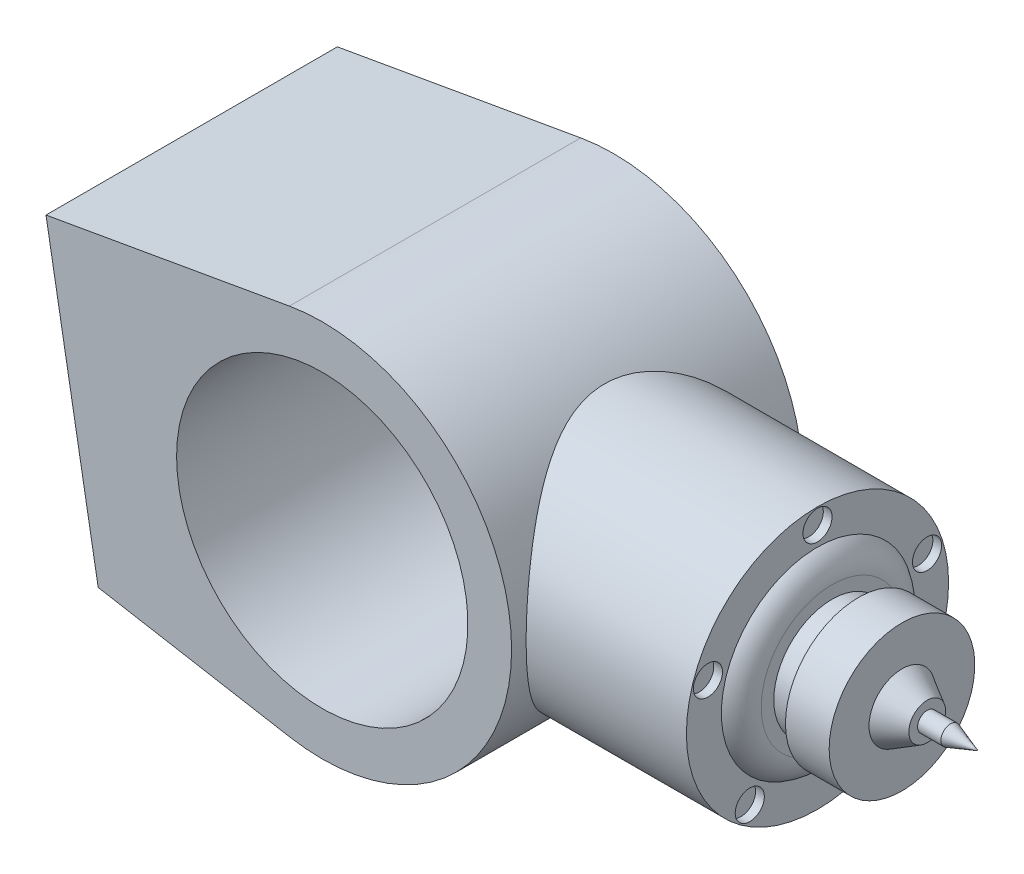
ISO-10303-21;
HEADER;
FILE_DESCRIPTION(('STEP AP214'),'2;1');
FILE_NAME('part.step','',(''),(''),'','','');
FILE_SCHEMA(('AUTOMOTIVE_DESIGN { 1 0 10303 214 1 1 1 1 }'));
ENDSEC;
DATA;
#1=APPLICATION_CONTEXT('core data for automotive mechanical design processes');
#2=APPLICATION_PROTOCOL_DEFINITION('international standard','automotive_design',2000,#1);
#3=PRODUCT_CONTEXT('',#1,'mechanical');
#4=PRODUCT('Part','Part','',(#3));
#5=PRODUCT_RELATED_PRODUCT_CATEGORY('part','',(#4));
#6=PRODUCT_DEFINITION_FORMATION('','',#4);
#7=PRODUCT_DEFINITION_CONTEXT('part definition',#1,'design');
#8=PRODUCT_DEFINITION('design','',#6,#7);
#9=PRODUCT_DEFINITION_SHAPE('','',#8);
#10=(LENGTH_UNIT() NAMED_UNIT(*) SI_UNIT(.MILLI.,.METRE.));
#11=(NAMED_UNIT(*) PLANE_ANGLE_UNIT() SI_UNIT($,.RADIAN.));
#12=(NAMED_UNIT(*) SI_UNIT($,.STERADIAN.) SOLID_ANGLE_UNIT());
#13=UNCERTAINTY_MEASURE_WITH_UNIT(LENGTH_MEASURE(1.E-05),#10,'distance_accuracy_value','');
#14=(GEOMETRIC_REPRESENTATION_CONTEXT(3) GLOBAL_UNCERTAINTY_ASSIGNED_CONTEXT((#13)) GLOBAL_UNIT_ASSIGNED_CONTEXT((#10,
#11,#12)) REPRESENTATION_CONTEXT('',''));
#15=CARTESIAN_POINT('',(0.,0.,0.));
#16=DIRECTION('',(0.,0.,1.));
#17=DIRECTION('',(1.,0.,0.));
#18=AXIS2_PLACEMENT_3D('',#15,#16,#17);
#19=CARTESIAN_POINT('',(165.660254037844,0.,0.));
#20=DIRECTION('',(-1.,0.,0.));
#21=DIRECTION('',(0.,0.,1.));
#22=AXIS2_PLACEMENT_3D('',#19,#20,#21);
#23=CONICAL_SURFACE('',#22,3.31020279040991,0.337384605531318);
#24=CARTESIAN_POINT('',(175.096490442596,0.,0.));
#25=VERTEX_POINT('',#24);
#26=VERTEX_LOOP('',#25);
#27=FACE_BOUND('',#26,.T.);
#28=CARTESIAN_POINT('',(165.660254037844,0.,0.));
#29=DIRECTION('',(-1.,0.,0.));
#30=DIRECTION('',(0.,0.,1.));
#31=AXIS2_PLACEMENT_3D('',#28,#29,#30);
#32=CIRCLE('',#31,3.31020279040991);
#33=CARTESIAN_POINT('',(165.660254037844,0.,3.31020279040991));
#34=VERTEX_POINT('',#33);
#35=EDGE_CURVE('E264',#34,#34,#32,.T.);
#36=ORIENTED_EDGE('',*,*,#35,.F.);
#37=EDGE_LOOP('',(#36));
#38=FACE_BOUND('',#37,.T.);
#39=ADVANCED_FACE('F37',(#27,#38),#23,.T.);
#40=CARTESIAN_POINT('',(0.,0.,0.));
#41=DIRECTION('',(-1.,0.,0.));
#42=DIRECTION('',(0.,0.,1.));
#43=AXIS2_PLACEMENT_3D('',#40,#41,#42);
#44=CYLINDRICAL_SURFACE('',#43,20.);
#45=CARTESIAN_POINT('',(125.,0.,0.));
#46=DIRECTION('',(1.,0.,0.));
#47=DIRECTION('',(0.,0.,-1.));
#48=AXIS2_PLACEMENT_3D('',#45,#46,#47);
#49=CIRCLE('',#48,20.);
#50=CARTESIAN_POINT('',(125.,0.,-20.));
#51=VERTEX_POINT('',#50);
#52=EDGE_CURVE('E111',#51,#51,#49,.F.);
#53=ORIENTED_EDGE('',*,*,#52,.F.);
#54=EDGE_LOOP('',(#53));
#55=FACE_BOUND('',#54,.T.);
#56=CARTESIAN_POINT('',(134.,0.,0.));
#57=DIRECTION('',(-1.,0.,0.));
#58=DIRECTION('',(0.,0.,1.));
#59=AXIS2_PLACEMENT_3D('',#56,#57,#58);
#60=CIRCLE('',#59,20.);
#61=CARTESIAN_POINT('',(134.,0.,20.));
#62=VERTEX_POINT('',#61);
#63=EDGE_CURVE('E125',#62,#62,#60,.T.);
#64=ORIENTED_EDGE('',*,*,#63,.T.);
#65=EDGE_LOOP('',(#64));
#66=FACE_BOUND('',#65,.T.);
#67=ADVANCED_FACE('F136',(#55,#66),#44,.T.);
#68=CARTESIAN_POINT('',(134.,0.,0.));
#69=DIRECTION('',(-1.,0.,0.));
#70=DIRECTION('',(0.,0.,1.));
#71=AXIS2_PLACEMENT_3D('',#68,#69,#70);
#72=PLANE('',#71);
#73=CARTESIAN_POINT('',(134.,0.,0.));
#74=DIRECTION('',(-1.,0.,0.));
#75=DIRECTION('',(0.,0.,1.));
#76=AXIS2_PLACEMENT_3D('',#73,#74,#75);
#77=CIRCLE('',#76,25.);
#78=CARTESIAN_POINT('',(134.,0.,25.));
#79=VERTEX_POINT('',#78);
#80=EDGE_CURVE('E279',#79,#79,#77,.T.);
#81=ORIENTED_EDGE('',*,*,#80,.T.);
#82=EDGE_LOOP('',(#81));
#83=FACE_BOUND('',#82,.T.);
#84=ORIENTED_EDGE('',*,*,#63,.F.);
#85=EDGE_LOOP('',(#84));
#86=FACE_BOUND('',#85,.T.);
#87=ADVANCED_FACE('F140',(#83,#86),#72,.T.);
#88=CARTESIAN_POINT('',(0.,0.,0.));
#89=DIRECTION('',(-1.,0.,0.));
#90=DIRECTION('',(0.,0.,1.));
#91=AXIS2_PLACEMENT_3D('',#88,#89,#90);
#92=CYLINDRICAL_SURFACE('',#91,25.);
#93=CARTESIAN_POINT('',(149.,0.,0.));
#94=DIRECTION('',(-1.,0.,0.));
#95=DIRECTION('',(0.,0.,1.));
#96=AXIS2_PLACEMENT_3D('',#93,#94,#95);
#97=CIRCLE('',#96,25.);
#98=CARTESIAN_POINT('',(149.,0.,25.));
#99=VERTEX_POINT('',#98);
#100=EDGE_CURVE('E277',#99,#99,#97,.T.);
#101=ORIENTED_EDGE('',*,*,#100,.T.);
#102=EDGE_LOOP('',(#101));
#103=FACE_BOUND('',#102,.T.);
#104=ORIENTED_EDGE('',*,*,#80,.F.);
#105=EDGE_LOOP('',(#104));
#106=FACE_BOUND('',#105,.T.);
#107=ADVANCED_FACE('F144',(#103,#106),#92,.T.);
#108=CARTESIAN_POINT('',(149.,0.,0.));
#109=DIRECTION('',(1.,0.,0.));
#110=DIRECTION('',(0.,0.,-1.));
#111=AXIS2_PLACEMENT_3D('',#108,#109,#110);
#112=PLANE('',#111);
#113=CARTESIAN_POINT('',(149.,0.,0.));
#114=DIRECTION('',(-1.,0.,0.));
#115=DIRECTION('',(0.,0.,1.));
#116=AXIS2_PLACEMENT_3D('',#113,#114,#115);
#117=CIRCLE('',#116,11.3102027904099);
#118=CARTESIAN_POINT('',(149.,0.,11.3102027904099));
#119=VERTEX_POINT('',#118);
#120=EDGE_CURVE('E274',#119,#119,#117,.T.);
#121=ORIENTED_EDGE('',*,*,#120,.T.);
#122=EDGE_LOOP('',(#121));
#123=FACE_BOUND('',#122,.T.);
#124=ORIENTED_EDGE('',*,*,#100,.F.);
#125=EDGE_LOOP('',(#124));
#126=FACE_BOUND('',#125,.T.);
#127=ADVANCED_FACE('F148',(#123,#126),#112,.T.);
#128=CARTESIAN_POINT('',(149.,0.,0.));
#129=DIRECTION('',(-1.,0.,0.));
#130=DIRECTION('',(0.,0.,1.));
#131=AXIS2_PLACEMENT_3D('',#128,#129,#130);
#132=CONICAL_SURFACE('',#131,11.3102027904099,0.523598775598294);
#133=CARTESIAN_POINT('',(157.660254037844,0.,0.));
#134=DIRECTION('',(-1.,0.,0.));
#135=DIRECTION('',(0.,0.,1.));
#136=AXIS2_PLACEMENT_3D('',#133,#134,#135);
#137=CIRCLE('',#136,6.31020279040992);
#138=CARTESIAN_POINT('',(157.660254037844,0.,6.31020279040992));
#139=VERTEX_POINT('',#138);
#140=EDGE_CURVE('E271',#139,#139,#137,.T.);
#141=ORIENTED_EDGE('',*,*,#140,.T.);
#142=EDGE_LOOP('',(#141));
#143=FACE_BOUND('',#142,.T.);
#144=ORIENTED_EDGE('',*,*,#120,.F.);
#145=EDGE_LOOP('',(#144));
#146=FACE_BOUND('',#145,.T.);
#147=ADVANCED_FACE('F152',(#143,#146),#132,.T.);
#148=CARTESIAN_POINT('',(157.660254037844,-1.45865036750889E-12,0.));
#149=DIRECTION('',(1.,0.,0.));
#150=DIRECTION('',(0.,0.,-1.));
#151=AXIS2_PLACEMENT_3D('',#148,#149,#150);
#152=PLANE('',#151);
#153=CARTESIAN_POINT('',(157.660254037844,0.,0.));
#154=DIRECTION('',(-1.,0.,0.));
#155=DIRECTION('',(0.,0.,1.));
#156=AXIS2_PLACEMENT_3D('',#153,#154,#155);
#157=CIRCLE('',#156,3.31020279040991);
#158=CARTESIAN_POINT('',(157.660254037844,0.,3.31020279040991));
#159=VERTEX_POINT('',#158);
#160=EDGE_CURVE('E268',#159,#159,#157,.T.);
#161=ORIENTED_EDGE('',*,*,#160,.T.);
#162=EDGE_LOOP('',(#161));
#163=FACE_BOUND('',#162,.T.);
#164=ORIENTED_EDGE('',*,*,#140,.F.);
#165=EDGE_LOOP('',(#164));
#166=FACE_BOUND('',#165,.T.);
#167=ADVANCED_FACE('F156',(#163,#166),#152,.T.);
#168=CARTESIAN_POINT('',(0.,0.,0.));
#169=DIRECTION('',(-1.,0.,0.));
#170=DIRECTION('',(0.,0.,1.));
#171=AXIS2_PLACEMENT_3D('',#168,#169,#170);
#172=CYLINDRICAL_SURFACE('',#171,3.31020279040991);
#173=ORIENTED_EDGE('',*,*,#35,.T.);
#174=EDGE_LOOP('',(#173));
#175=FACE_BOUND('',#174,.T.);
#176=ORIENTED_EDGE('',*,*,#160,.F.);
#177=EDGE_LOOP('',(#176));
#178=FACE_BOUND('',#177,.T.);
#179=ADVANCED_FACE('F160',(#175,#178),#172,.T.);
#180=CARTESIAN_POINT('',(125.,0.,0.));
#181=DIRECTION('',(1.,0.,0.));
#182=DIRECTION('',(0.,0.,-1.));
#183=AXIS2_PLACEMENT_3D('',#180,#181,#182);
#184=PLANE('',#183);
#185=CARTESIAN_POINT('',(125.,0.,0.));
#186=DIRECTION('',(1.,0.,0.));
#187=DIRECTION('',(0.,0.,-1.));
#188=AXIS2_PLACEMENT_3D('',#185,#186,#187);
#189=CIRCLE('',#188,24.3397459621556);
#190=CARTESIAN_POINT('',(125.,0.,-24.3397459621556));
#191=VERTEX_POINT('',#190);
#192=EDGE_CURVE('E267',#191,#191,#189,.T.);
#193=ORIENTED_EDGE('',*,*,#192,.T.);
#194=EDGE_LOOP('',(#193));
#195=FACE_BOUND('',#194,.T.);
#196=ORIENTED_EDGE('',*,*,#52,.T.);
#197=EDGE_LOOP('',(#196));
#198=FACE_BOUND('',#197,.T.);
#199=ADVANCED_FACE('F164',(#195,#198),#184,.T.);
#200=CARTESIAN_POINT('',(0.,0.,50.));
#201=DIRECTION('',(0.,0.,-1.));
#202=DIRECTION('',(-1.,0.,0.));
#203=AXIS2_PLACEMENT_3D('',#200,#201,#202);
#204=CYLINDRICAL_SURFACE('',#203,50.);
#205=CARTESIAN_POINT('',(0.,0.,50.));
#206=DIRECTION('',(0.,0.,1.));
#207=DIRECTION('',(1.,0.,0.));
#208=AXIS2_PLACEMENT_3D('',#205,#206,#207);
#209=CIRCLE('',#208,50.);
#210=CARTESIAN_POINT('',(-50.,0.,50.));
#211=VERTEX_POINT('',#210);
#212=EDGE_CURVE('E108',#211,#211,#209,.T.);
#213=CARTESIAN_POINT('',(0.,0.,-50.));
#214=DIRECTION('',(0.,0.,1.));
#215=DIRECTION('',(1.,0.,0.));
#216=AXIS2_PLACEMENT_3D('',#213,#214,#215);
#217=CIRCLE('',#216,50.);
#218=CARTESIAN_POINT('',(-50.,0.,-50.));
#219=VERTEX_POINT('',#218);
#220=EDGE_CURVE('E104',#219,#219,#217,.T.);
#221=CARTESIAN_POINT('',(-50.,0.,50.));
#222=CARTESIAN_POINT('',(-50.,0.,48.9583333333333));
#223=CARTESIAN_POINT('',(-50.,0.,47.9166666666667));
#224=CARTESIAN_POINT('',(-50.,0.,45.8333333333333));
#225=CARTESIAN_POINT('',(-50.,0.,44.7916666666667));
#226=CARTESIAN_POINT('',(-50.,0.,42.7083333333333));
#227=CARTESIAN_POINT('',(-50.,0.,41.6666666666667));
#228=CARTESIAN_POINT('',(-50.,0.,39.5833333333333));
#229=CARTESIAN_POINT('',(-50.,0.,38.5416666666667));
#230=CARTESIAN_POINT('',(-50.,0.,36.4583333333333));
#231=CARTESIAN_POINT('',(-50.,0.,35.4166666666667));
#232=CARTESIAN_POINT('',(-50.,0.,33.3333333333333));
#233=CARTESIAN_POINT('',(-50.,0.,32.2916666666667));
#234=CARTESIAN_POINT('',(-50.,0.,30.2083333333333));
#235=CARTESIAN_POINT('',(-50.,0.,29.1666666666667));
#236=CARTESIAN_POINT('',(-50.,0.,27.0833333333333));
#237=CARTESIAN_POINT('',(-50.,0.,26.0416666666667));
#238=CARTESIAN_POINT('',(-50.,0.,23.9583333333333));
#239=CARTESIAN_POINT('',(-50.,0.,22.9166666666667));
#240=CARTESIAN_POINT('',(-50.,0.,20.8333333333333));
#241=CARTESIAN_POINT('',(-50.,0.,19.7916666666667));
#242=CARTESIAN_POINT('',(-50.,0.,17.7083333333333));
#243=CARTESIAN_POINT('',(-50.,0.,16.6666666666667));
#244=CARTESIAN_POINT('',(-50.,0.,14.5833333333333));
#245=CARTESIAN_POINT('',(-50.,0.,13.5416666666667));
#246=CARTESIAN_POINT('',(-50.,0.,11.4583333333333));
#247=CARTESIAN_POINT('',(-50.,0.,10.4166666666667));
#248=CARTESIAN_POINT('',(-50.,0.,8.33333333333333));
#249=CARTESIAN_POINT('',(-50.,0.,7.29166666666666));
#250=CARTESIAN_POINT('',(-50.,0.,5.20833333333333));
#251=CARTESIAN_POINT('',(-50.,0.,4.16666666666666));
#252=CARTESIAN_POINT('',(-50.,0.,2.08333333333333));
#253=CARTESIAN_POINT('',(-50.,0.,1.04166666666666));
#254=CARTESIAN_POINT('',(-50.,0.,-1.04166666666667));
#255=CARTESIAN_POINT('',(-50.,0.,-2.08333333333334));
#256=CARTESIAN_POINT('',(-50.,0.,-4.16666666666667));
#257=CARTESIAN_POINT('',(-50.,0.,-5.20833333333334));
#258=CARTESIAN_POINT('',(-50.,0.,-7.29166666666667));
#259=CARTESIAN_POINT('',(-50.,0.,-8.33333333333334));
#260=CARTESIAN_POINT('',(-50.,0.,-10.4166666666667));
#261=CARTESIAN_POINT('',(-50.,0.,-11.4583333333333));
#262=CARTESIAN_POINT('',(-50.,0.,-13.5416666666667));
#263=CARTESIAN_POINT('',(-50.,0.,-14.5833333333333));
#264=CARTESIAN_POINT('',(-50.,0.,-16.6666666666667));
#265=CARTESIAN_POINT('',(-50.,0.,-17.7083333333333));
#266=CARTESIAN_POINT('',(-50.,0.,-19.7916666666667));
#267=CARTESIAN_POINT('',(-50.,0.,-20.8333333333333));
#268=CARTESIAN_POINT('',(-50.,0.,-22.9166666666667));
#269=CARTESIAN_POINT('',(-50.,0.,-23.9583333333333));
#270=CARTESIAN_POINT('',(-50.,0.,-26.0416666666667));
#271=CARTESIAN_POINT('',(-50.,0.,-27.0833333333333));
#272=CARTESIAN_POINT('',(-50.,0.,-29.1666666666667));
#273=CARTESIAN_POINT('',(-50.,0.,-30.2083333333333));
#274=CARTESIAN_POINT('',(-50.,0.,-32.2916666666667));
#275=CARTESIAN_POINT('',(-50.,0.,-33.3333333333333));
#276=CARTESIAN_POINT('',(-50.,0.,-35.4166666666667));
#277=CARTESIAN_POINT('',(-50.,0.,-36.4583333333333));
#278=CARTESIAN_POINT('',(-50.,0.,-38.5416666666667));
#279=CARTESIAN_POINT('',(-50.,0.,-39.5833333333333));
#280=CARTESIAN_POINT('',(-50.,0.,-41.6666666666667));
#281=CARTESIAN_POINT('',(-50.,0.,-42.7083333333333));
#282=CARTESIAN_POINT('',(-50.,0.,-44.7916666666667));
#283=CARTESIAN_POINT('',(-50.,0.,-45.8333333333333));
#284=CARTESIAN_POINT('',(-50.,0.,-47.9166666666667));
#285=CARTESIAN_POINT('',(-50.,0.,-48.9583333333333));
#286=CARTESIAN_POINT('',(-50.,0.,-50.));
#287=B_SPLINE_CURVE_WITH_KNOTS('',3,(#221,#222,#223,#224,#225,#226,#227,#228,#229,#230,#231,
#232,#233,#234,#235,#236,#237,#238,#239,#240,#241,#242,#243,#244,#245,#246,#247,#248,#249,#250,
#251,#252,#253,#254,#255,#256,#257,#258,#259,#260,#261,#262,#263,#264,#265,#266,#267,#268,#269,
#270,#271,#272,#273,#274,#275,#276,#277,#278,#279,#280,#281,#282,#283,#284,#285,#286),
.UNSPECIFIED.,.F.,.F.,(4,2,2,2,2,2,2,2,2,2,2,2,2,2,2,2,2,2,2,2,2,2,2,2,2,2,2,2,2,2,2,2,4),(0.,
3.125,6.25,9.37499999999999,12.5,15.625,18.75,21.875,25.,28.125,31.25,34.375,37.5,40.625,43.75,
46.875,50.,53.125,56.25,59.375,62.5,65.625,68.75,71.875,75.,78.125,81.25,84.375,87.5,90.625,
93.75,96.875,100.),.UNSPECIFIED.);
#288=EDGE_CURVE('BSEAM209',#211,#219,#287,.T.);
#289=ORIENTED_EDGE('',*,*,#212,.T.);
#290=ORIENTED_EDGE('',*,*,#220,.F.);
#291=ORIENTED_EDGE('',*,*,#288,.T.);
#292=ORIENTED_EDGE('',*,*,#288,.F.);
#293=EDGE_LOOP('',(#289,#291,#290,#292));
#294=FACE_BOUND('',#293,.T.);
#295=ADVANCED_FACE('F209',(#294),#204,.F.);
#296=CARTESIAN_POINT('',(-147.681836522835,-40.,50.));
#297=DIRECTION('',(0.173385141434729,0.984854097178693,0.));
#298=DIRECTION('',(-0.984854097178694,0.173385141434729,0.));
#299=AXIS2_PLACEMENT_3D('',#296,#297,#298);
#300=PLANE('',#299);
#301=DIRECTION('',(0.984854097178693,-0.173385141434729,0.));
#302=VECTOR('',#301,1.);
#303=CARTESIAN_POINT('',(-147.681836522835,-40.,50.));
#304=LINE('',#303,#302);
#305=CARTESIAN_POINT('',(-76.9078082683274,-52.4598810463057,50.));
#306=VERTEX_POINT('',#305);
#307=CARTESIAN_POINT('',(-11.2700341932574,-64.0155163166151,50.));
#308=VERTEX_POINT('',#307);
#309=EDGE_CURVE('E99',#306,#308,#304,.T.);
#310=ORIENTED_EDGE('',*,*,#309,.F.);
#311=DIRECTION('',(0.,0.,-1.));
#312=VECTOR('',#311,1.);
#313=CARTESIAN_POINT('',(-76.9078082683274,-52.4598810463057,50.));
#314=LINE('',#313,#312);
#315=CARTESIAN_POINT('',(-76.9078082683274,-52.4598810463057,-50.));
#316=VERTEX_POINT('',#315);
#317=EDGE_CURVE('E55',#306,#316,#314,.T.);
#318=ORIENTED_EDGE('',*,*,#317,.T.);
#319=DIRECTION('',(0.984854097178693,-0.173385141434729,0.));
#320=VECTOR('',#319,1.);
#321=CARTESIAN_POINT('',(-147.681836522835,-40.,-50.));
#322=LINE('',#321,#320);
#323=CARTESIAN_POINT('',(-11.2700341932574,-64.0155163166151,-50.));
#324=VERTEX_POINT('',#323);
#325=EDGE_CURVE('E41',#316,#324,#322,.T.);
#326=ORIENTED_EDGE('',*,*,#325,.T.);
#327=DIRECTION('',(0.,0.,-1.));
#328=VECTOR('',#327,1.);
#329=CARTESIAN_POINT('',(-11.2700341932574,-64.0155163166151,50.));
#330=LINE('',#329,#328);
#331=EDGE_CURVE('E231',#308,#324,#330,.T.);
#332=ORIENTED_EDGE('',*,*,#331,.F.);
#333=EDGE_LOOP('',(#310,#318,#326,#332));
#334=FACE_BOUND('',#333,.T.);
#335=ADVANCED_FACE('F39',(#334),#300,.F.);
#336=CARTESIAN_POINT('',(0.,0.,50.));
#337=DIRECTION('',(0.,0.,1.));
#338=DIRECTION('',(1.,0.,0.));
#339=AXIS2_PLACEMENT_3D('',#336,#337,#338);
#340=PLANE('',#339);
#341=DIRECTION('',(-0.173385141434729,0.984854097178693,0.));
#342=VECTOR('',#341,1.);
#343=CARTESIAN_POINT('',(-70.8966594279861,-86.6041249830893,50.));
#344=LINE('',#343,#342);
#345=CARTESIAN_POINT('',(-94.8238089459786,49.3057404275704,50.));
#346=VERTEX_POINT('',#345);
#347=EDGE_CURVE('E47',#306,#346,#344,.T.);
#348=ORIENTED_EDGE('',*,*,#347,.F.);
#349=ORIENTED_EDGE('',*,*,#309,.T.);
#350=CARTESIAN_POINT('',(0.,0.,50.));
#351=DIRECTION('',(0.,0.,1.));
#352=DIRECTION('',(1.,0.,0.));
#353=AXIS2_PLACEMENT_3D('',#350,#351,#352);
#354=CIRCLE('',#353,65.);
#355=CARTESIAN_POINT('',(-11.2700341932574,64.0155163166151,50.));
#356=VERTEX_POINT('',#355);
#357=EDGE_CURVE('E94',#308,#356,#354,.T.);
#358=ORIENTED_EDGE('',*,*,#357,.T.);
#359=DIRECTION('',(-0.984854097178693,-0.173385141434729,0.));
#360=VECTOR('',#359,1.);
#361=CARTESIAN_POINT('',(-147.681836522835,40.,50.));
#362=LINE('',#361,#360);
#363=EDGE_CURVE('E88',#356,#346,#362,.T.);
#364=ORIENTED_EDGE('',*,*,#363,.T.);
#365=EDGE_LOOP('',(#348,#349,#358,#364));
#366=FACE_BOUND('',#365,.T.);
#367=ORIENTED_EDGE('',*,*,#212,.F.);
#368=EDGE_LOOP('',(#367));
#369=FACE_BOUND('',#368,.T.);
#370=ADVANCED_FACE('F91',(#366,#369),#340,.T.);
#371=CARTESIAN_POINT('',(-147.681836522835,40.,50.));
#372=DIRECTION('',(0.173385141434729,-0.984854097178693,0.));
#373=DIRECTION('',(0.984854097178694,0.173385141434729,0.));
#374=AXIS2_PLACEMENT_3D('',#371,#372,#373);
#375=PLANE('',#374);
#376=DIRECTION('',(-0.984854097178693,-0.173385141434729,0.));
#377=VECTOR('',#376,1.);
#378=CARTESIAN_POINT('',(-147.681836522835,40.,-50.));
#379=LINE('',#378,#377);
#380=CARTESIAN_POINT('',(-11.2700341932574,64.0155163166151,-50.));
#381=VERTEX_POINT('',#380);
#382=CARTESIAN_POINT('',(-94.8238089459786,49.3057404275704,-50.));
#383=VERTEX_POINT('',#382);
#384=EDGE_CURVE('E90',#381,#383,#379,.T.);
#385=ORIENTED_EDGE('',*,*,#384,.T.);
#386=DIRECTION('',(0.,0.,-1.));
#387=VECTOR('',#386,1.);
#388=CARTESIAN_POINT('',(-94.8238089459786,49.3057404275704,-50.));
#389=LINE('',#388,#387);
#390=EDGE_CURVE('E11',#346,#383,#389,.T.);
#391=ORIENTED_EDGE('',*,*,#390,.F.);
#392=ORIENTED_EDGE('',*,*,#363,.F.);
#393=DIRECTION('',(0.,0.,-1.));
#394=VECTOR('',#393,1.);
#395=CARTESIAN_POINT('',(-11.2700341932574,64.0155163166151,50.));
#396=LINE('',#395,#394);
#397=EDGE_CURVE('E97',#356,#381,#396,.T.);
#398=ORIENTED_EDGE('',*,*,#397,.T.);
#399=EDGE_LOOP('',(#385,#391,#392,#398));
#400=FACE_BOUND('',#399,.T.);
#401=ADVANCED_FACE('F86',(#400),#375,.F.);
#402=CARTESIAN_POINT('',(0.,0.,-50.));
#403=DIRECTION('',(0.,0.,1.));
#404=DIRECTION('',(1.,0.,0.));
#405=AXIS2_PLACEMENT_3D('',#402,#403,#404);
#406=PLANE('',#405);
#407=ORIENTED_EDGE('',*,*,#325,.F.);
#408=DIRECTION('',(-0.173385141434729,0.984854097178693,0.));
#409=VECTOR('',#408,1.);
#410=CARTESIAN_POINT('',(-70.8966594279861,-86.6041249830893,-50.));
#411=LINE('',#410,#409);
#412=EDGE_CURVE('E107',#316,#383,#411,.T.);
#413=ORIENTED_EDGE('',*,*,#412,.T.);
#414=ORIENTED_EDGE('',*,*,#384,.F.);
#415=CARTESIAN_POINT('',(0.,0.,-50.));
#416=DIRECTION('',(0.,0.,1.));
#417=DIRECTION('',(1.,0.,0.));
#418=AXIS2_PLACEMENT_3D('',#415,#416,#417);
#419=CIRCLE('',#418,65.);
#420=EDGE_CURVE('E102',#324,#381,#419,.T.);
#421=ORIENTED_EDGE('',*,*,#420,.F.);
#422=EDGE_LOOP('',(#407,#413,#414,#421));
#423=FACE_BOUND('',#422,.T.);
#424=ORIENTED_EDGE('',*,*,#220,.T.);
#425=EDGE_LOOP('',(#424));
#426=FACE_BOUND('',#425,.T.);
#427=ADVANCED_FACE('F214',(#423,#426),#406,.F.);
#428=CARTESIAN_POINT('',(0.,0.,50.));
#429=DIRECTION('',(0.,0.,-1.));
#430=DIRECTION('',(-1.,0.,0.));
#431=AXIS2_PLACEMENT_3D('',#428,#429,#430);
#432=CYLINDRICAL_SURFACE('',#431,65.);
#433=CARTESIAN_POINT('',(65.0000000001137,0.,-45.));
#434=CARTESIAN_POINT('',(65.0000011697181,1.12147330120246,-45.0000012025283));
#435=CARTESIAN_POINT('',(64.9709159765516,2.2429294523014,-44.9580201602485));
#436=CARTESIAN_POINT('',(64.8553068641088,4.47658414078142,-44.7907856093699));
#437=CARTESIAN_POINT('',(64.7687842573015,5.58878288911006,-44.6655340035383));
#438=CARTESIAN_POINT('',(64.5403785763092,7.79555151847874,-44.3336771879705));
#439=CARTESIAN_POINT('',(64.3984760503486,8.89011506447151,-44.1270433931251));
#440=CARTESIAN_POINT('',(64.0626457436951,11.0533096019728,-43.6354760134044));
#441=CARTESIAN_POINT('',(63.8687169569865,12.1219400915861,-43.3505409144385));
#442=CARTESIAN_POINT('',(63.4342222744675,14.2212125160476,-42.7078017297056));
#443=CARTESIAN_POINT('',(63.1938918545653,15.2520162370033,-42.3503651251488));
#444=CARTESIAN_POINT('',(62.6709259446929,17.2756280115262,-41.5659763086902));
#445=CARTESIAN_POINT('',(62.388290736492,18.268436318105,-41.1390245597897));
#446=CARTESIAN_POINT('',(61.7861085539327,20.2116697228775,-40.2199419970848));
#447=CARTESIAN_POINT('',(61.466561906264,21.1620951960829,-39.7278117601457));
#448=CARTESIAN_POINT('',(60.7962171584079,23.0172309124277,-38.6825647509822));
#449=CARTESIAN_POINT('',(60.4454175300351,23.9219389167142,-38.1294449962223));
#450=CARTESIAN_POINT('',(59.6865648974496,25.7601880140177,-36.915173761797));
#451=CARTESIAN_POINT('',(59.2761881540223,26.6893215363351,-36.248804000553));
#452=CARTESIAN_POINT('',(58.4330275057276,28.4880338622912,-34.8529502059269));
#453=CARTESIAN_POINT('',(58.0002425478209,29.3576098626484,-34.1234632053655));
#454=CARTESIAN_POINT('',(57.1195111836506,31.036448638846,-32.6040251352454));
#455=CARTESIAN_POINT('',(56.6715447181919,31.8456267033401,-31.8139921794173));
#456=CARTESIAN_POINT('',(55.7691986061166,33.4006700551768,-30.1773036557044));
#457=CARTESIAN_POINT('',(55.3148185876146,34.1465316534245,-29.3306447936772));
#458=CARTESIAN_POINT('',(54.3303114345621,35.6959084068863,-27.432646615952));
#459=CARTESIAN_POINT('',(53.8005937511295,36.4872853280202,-26.371145065658));
#460=CARTESIAN_POINT('',(52.7593327891959,37.9773509509875,-24.1760402563956));
#461=CARTESIAN_POINT('',(52.2477941160252,38.6760162868228,-23.0424189272575));
#462=CARTESIAN_POINT('',(51.2608149265068,39.9749077721712,-20.7072341856989));
#463=CARTESIAN_POINT('',(50.7853275075297,40.5752630453933,-19.505762726803));
#464=CARTESIAN_POINT('',(49.8892399163816,41.6721166929997,-17.0369318640709));
#465=CARTESIAN_POINT('',(49.4686114171681,42.1686687478827,-15.7696069410014));
#466=CARTESIAN_POINT('',(48.8208029416899,42.9149535309542,-13.5723996352889));
#467=CARTESIAN_POINT('',(48.5738420263577,43.1936925213224,-12.6581208441049));
#468=CARTESIAN_POINT('',(48.1238801744139,43.694456964977,-10.8035389223623));
#469=CARTESIAN_POINT('',(47.9208721021944,43.9164916250885,-9.86324004408143));
#470=CARTESIAN_POINT('',(47.566075492656,44.3005296261292,-7.96250438664124));
#471=CARTESIAN_POINT('',(47.4142038087055,44.4626304606416,-7.00210302150197));
#472=CARTESIAN_POINT('',(47.1671263845184,44.7246555122378,-5.06554052629213));
#473=CARTESIAN_POINT('',(47.0719206259535,44.8245797494324,-4.08937940131913));
#474=CARTESIAN_POINT('',(46.9418899090946,44.960738819867,-2.12323648480341));
#475=CARTESIAN_POINT('',(46.9073939345419,44.9966266570422,-1.13320851845319));
#476=CARTESIAN_POINT('',(46.9013571135475,45.0029190462423,0.847248377087453));
#477=CARTESIAN_POINT('',(46.9298161498629,44.9733237202185,1.83767730552772));
#478=CARTESIAN_POINT('',(47.0484302849816,44.8492190899206,3.81128752428478));
#479=CARTESIAN_POINT('',(47.1386230552094,44.7546701492427,4.79446401850071));
#480=CARTESIAN_POINT('',(47.3768313176071,44.5024241630877,6.74551496466893));
#481=CARTESIAN_POINT('',(47.5248480621428,44.3447257499019,7.71338908472619));
#482=CARTESIAN_POINT('',(47.862176427183,43.9803320764274,9.5691936696415));
#483=CARTESIAN_POINT('',(48.0484149088852,43.7772163066598,10.4583970625466));
#484=CARTESIAN_POINT('',(48.4609441046393,43.3201064011915,12.2144143492128));
#485=CARTESIAN_POINT('',(48.68724960451,43.0660934784831,13.081219841753));
#486=CARTESIAN_POINT('',(49.1738509640367,42.5096331932483,14.7898225666874));
#487=CARTESIAN_POINT('',(49.4341648638817,42.2071601049978,15.6316062329429));
#488=CARTESIAN_POINT('',(49.9825182796317,41.5563350032156,17.2876417418961));
#489=CARTESIAN_POINT('',(50.2705534011678,41.2079902580467,18.1018979206897));
#490=CARTESIAN_POINT('',(51.0225431471325,40.2767822129293,20.1137766396751));
#491=CARTESIAN_POINT('',(51.5007434523307,39.66548914406,21.2930273345127));
#492=CARTESIAN_POINT('',(52.4891158781454,38.3480299208551,23.5833678403871));
#493=CARTESIAN_POINT('',(52.9993005340565,37.6418264436759,24.6944305853474));
#494=CARTESIAN_POINT('',(54.036155797347,36.1376496350203,26.8476775780046));
#495=CARTESIAN_POINT('',(54.5628535785436,35.3395185623598,27.8897384505662));
#496=CARTESIAN_POINT('',(55.6171804467152,33.6558443419713,29.8998791095585));
#497=CARTESIAN_POINT('',(56.1448094104392,32.7703120184278,30.8679680307451));
#498=CARTESIAN_POINT('',(57.1932449701109,30.9045304086367,32.7363921475613));
#499=CARTESIAN_POINT('',(57.7139191350957,29.9233731295242,33.6358963165023));
#500=CARTESIAN_POINT('',(58.7296419536439,27.8771206486033,35.3503553497878));
#501=CARTESIAN_POINT('',(59.2246882700635,26.8120178136035,36.1653025096977));
#502=CARTESIAN_POINT('',(60.1756566955614,24.603520952248,37.7024332048774));
#503=CARTESIAN_POINT('',(60.6316475651571,23.4602711709855,38.4247809320595));
#504=CARTESIAN_POINT('',(61.4931891608189,21.0989507187401,39.7703323765734));
#505=CARTESIAN_POINT('',(61.8987550178708,19.8809026570956,40.3935658507682));
#506=CARTESIAN_POINT('',(62.5646802947763,17.6549035875832,41.4059204565365));
#507=CARTESIAN_POINT('',(62.8372982548448,16.6602403417803,41.8163120534981));
#508=CARTESIAN_POINT('',(63.3397164077311,14.6345031625214,42.5675669112311));
#509=CARTESIAN_POINT('',(63.5695225359965,13.603434299966,42.9084398107212));
#510=CARTESIAN_POINT('',(63.9815049902584,11.5110112910087,43.5164676119099));
#511=CARTESIAN_POINT('',(64.1637052650732,10.4496726714692,43.7836595836361));
#512=CARTESIAN_POINT('',(64.4766398657941,8.30296993184072,44.2409869387343));
#513=CARTESIAN_POINT('',(64.6073730982249,7.21760530180952,44.4311206849198));
#514=CARTESIAN_POINT('',(64.8147345736677,5.02649787175712,44.7321113931975));
#515=CARTESIAN_POINT('',(64.8911534961689,3.92069290490446,44.8426616714372));
#516=CARTESIAN_POINT('',(64.9872183357684,1.70145350776879,44.9815637341557));
#517=CARTESIAN_POINT('',(65.0068642771873,0.588019080754336,45.0099155538473));
#518=CARTESIAN_POINT('',(64.9889001241946,-1.63741781930917,44.9839662509351));
#519=CARTESIAN_POINT('',(64.9512898349754,-2.74942028747326,44.9296648471134));
#520=CARTESIAN_POINT('',(64.8197344180534,-4.96298947366981,44.7392747901959));
#521=CARTESIAN_POINT('',(64.7257910494471,-6.06455651647515,44.6031886909662));
#522=CARTESIAN_POINT('',(64.4911757033097,-8.18254449211552,44.2620157992045));
#523=CARTESIAN_POINT('',(64.3536808680187,-9.20007959997181,44.0616107864466));
#524=CARTESIAN_POINT('',(64.0337856060918,-11.212133713653,43.5930613516695));
#525=CARTESIAN_POINT('',(63.851387385551,-12.2066538475742,43.3249202574945));
#526=CARTESIAN_POINT('',(63.4451725249088,-14.1673074608466,42.7239854011624));
#527=CARTESIAN_POINT('',(63.2213525684645,-15.1334386601166,42.3911864622067));
#528=CARTESIAN_POINT('',(62.7363363526785,-17.0327019487218,41.6643868113891));
#529=CARTESIAN_POINT('',(62.4751380044864,-17.9658321901976,41.2703826790366));
#530=CARTESIAN_POINT('',(61.8990085085139,-19.8637431772342,40.3931275129034));
#531=CARTESIAN_POINT('',(61.5815209528519,-20.82568069292,39.9054081529041));
#532=CARTESIAN_POINT('',(60.9142086391414,-22.7035764997292,38.8677076181242));
#533=CARTESIAN_POINT('',(60.5643826081103,-23.6195329786476,38.31772399216));
#534=CARTESIAN_POINT('',(59.8381347129423,-25.4032558353351,37.1592008079453));
#535=CARTESIAN_POINT('',(59.4616987975463,-26.2709963143239,36.5506302507569));
#536=CARTESIAN_POINT('',(58.688457767036,-27.9557544991446,35.2787474176664));
#537=CARTESIAN_POINT('',(58.2916515549596,-28.7727694681088,34.6154321925351));
#538=CARTESIAN_POINT('',(57.4151711853819,-30.4889708749863,33.1199200847206));
#539=CARTESIAN_POINT('',(56.9328754552573,-31.378521200688,32.2781812569594));
#540=CARTESIAN_POINT('',(55.9590893109121,-33.0839042215123,30.527835244564));
#541=CARTESIAN_POINT('',(55.4675975421277,-33.8997259516762,29.6192181500952));
#542=CARTESIAN_POINT('',(54.4860350387425,-35.4558699474056,27.7375714934049));
#543=CARTESIAN_POINT('',(53.9959654596146,-36.19614189864,26.7644997080065));
#544=CARTESIAN_POINT('',(53.0294834997464,-37.597850236097,24.7568233036444));
#545=CARTESIAN_POINT('',(52.5530693284179,-38.2592969946545,23.7222268074213));
#546=CARTESIAN_POINT('',(51.6799413477288,-39.4291013564603,21.7149007388813));
#547=CARTESIAN_POINT('',(51.2803372484842,-39.9463152685129,20.7485884228159));
#548=CARTESIAN_POINT('',(50.5123974548936,-40.91306366617,18.7705314851949));
#549=CARTESIAN_POINT('',(50.1440619804675,-41.362597675782,17.7587865441767));
#550=CARTESIAN_POINT('',(49.4504928922384,-42.1893301292667,15.6937972650691));
#551=CARTESIAN_POINT('',(49.125190641249,-42.566644202945,14.6406225749562));
#552=CARTESIAN_POINT('',(48.5290098021027,-43.245109861721,12.4950157035347));
#553=CARTESIAN_POINT('',(48.2581179989966,-43.5462799449156,11.4025931307334));
#554=CARTESIAN_POINT('',(47.8271610412386,-44.0186874861169,9.39216299944066));
#555=CARTESIAN_POINT('',(47.6558419905228,-44.2036946073197,8.47979353570975));
#556=CARTESIAN_POINT('',(47.3627606953039,-44.5175832444962,6.637575826688));
#557=CARTESIAN_POINT('',(47.2409923142231,-44.6464717105948,5.70772976070927));
#558=CARTESIAN_POINT('',(47.0516661570504,-44.8459556683359,3.83718735817522));
#559=CARTESIAN_POINT('',(46.9840561376512,-44.9166073394184,2.89650236821063));
#560=CARTESIAN_POINT('',(46.9055698265683,-44.9985645522096,1.01014116515578));
#561=CARTESIAN_POINT('',(46.8946943314281,-45.0098692606967,0.0644648821751739));
#562=CARTESIAN_POINT('',(46.9301408777117,-44.9729085245492,-1.82506201386276));
#563=CARTESIAN_POINT('',(46.9764888551693,-44.9246160680303,-2.76891160473679));
#564=CARTESIAN_POINT('',(47.1245232303028,-44.7693052695391,-4.64731891289354));
#565=CARTESIAN_POINT('',(47.2262092962434,-44.6622872796089,-5.58187668584374));
#566=CARTESIAN_POINT('',(47.4811423262621,-44.3911660407903,-7.43666598606074));
#567=CARTESIAN_POINT('',(47.6344529193932,-44.2269923369634,-8.356878360492));
#568=CARTESIAN_POINT('',(47.9871889035588,-43.8440109221378,-10.1768310643376));
#569=CARTESIAN_POINT('',(48.1866204648678,-43.6251959006604,-11.0765686368326));
#570=CARTESIAN_POINT('',(48.6908782922354,-43.0625185245685,-13.1167261780584));
#571=CARTESIAN_POINT('',(49.0093972350585,-42.7008255731369,-14.2488681052135));
#572=CARTESIAN_POINT('',(49.6995544941594,-41.8955268796905,-16.4668795226324));
#573=CARTESIAN_POINT('',(50.0712093704145,-41.4518955887124,-17.5527344499411));
#574=CARTESIAN_POINT('',(50.8544123719742,-40.4872212981038,-19.6760329984267));
#575=CARTESIAN_POINT('',(51.2660067549012,-39.9660881554155,-20.7134183727587));
#576=CARTESIAN_POINT('',(52.1162118793038,-38.8508952329185,-22.7363587217814));
#577=CARTESIAN_POINT('',(52.5548209260512,-38.2568400254592,-23.7219169406022));
#578=CARTESIAN_POINT('',(53.4579357785479,-36.9847423381297,-25.6613286822585));
#579=CARTESIAN_POINT('',(53.9228021101348,-36.3051118639085,-26.6139712103031));
#580=CARTESIAN_POINT('',(54.8583333343924,-34.8753950985083,-28.4617532840688));
#581=CARTESIAN_POINT('',(55.3289982185466,-34.1253089107972,-29.3568929142326));
#582=CARTESIAN_POINT('',(56.266433913348,-32.5564691651951,-31.0876310121425));
#583=CARTESIAN_POINT('',(56.7332035093406,-31.7376950080871,-31.9232114783978));
#584=CARTESIAN_POINT('',(57.6535165855409,-30.03348165203,-33.531518939049));
#585=CARTESIAN_POINT('',(58.1070588196734,-29.1480362003166,-34.3042400240075));
#586=CARTESIAN_POINT('',(59.0635284336213,-27.1643113596312,-35.9022819462616));
#587=CARTESIAN_POINT('',(59.5626106290885,-26.0547472869685,-36.7159606163302));
#588=CARTESIAN_POINT('',(60.5176757229321,-23.752128034849,-38.2458641369233));
#589=CARTESIAN_POINT('',(60.9736519283036,-22.5590599397297,-38.9620738611492));
#590=CARTESIAN_POINT('',(61.6149926579379,-20.7127348127414,-39.9558623322044));
#591=CARTESIAN_POINT('',(61.8215919655146,-20.0881105840089,-40.2735888165148));
#592=CARTESIAN_POINT('',(62.2191547005829,-18.8206694867646,-40.8812436548817));
#593=CARTESIAN_POINT('',(62.410120377954,-18.1778552540083,-41.1711760098996));
#594=CARTESIAN_POINT('',(62.7748527233661,-16.875283117673,-41.7219931318324));
#595=CARTESIAN_POINT('',(62.9486230408531,-16.21552884695,-41.9828840638094));
#596=CARTESIAN_POINT('',(63.277535647572,-14.880401155831,-42.4744610119256));
#597=CARTESIAN_POINT('',(63.4326792844196,-14.2050288695992,-42.7051492133021));
#598=CARTESIAN_POINT('',(63.8070721968084,-12.4447010544976,-43.2597449448083));
#599=CARTESIAN_POINT('',(64.0114184467984,-11.3490405228702,-43.5602757498274));
#600=CARTESIAN_POINT('',(64.3654191982108,-9.129913459789,-44.0788276443959));
#601=CARTESIAN_POINT('',(64.515082004951,-8.00645117856103,-44.2968612637914));
#602=CARTESIAN_POINT('',(64.7559993186983,-5.740822537286,-44.6470112993722));
#603=CARTESIAN_POINT('',(64.8472977570736,-4.59867091061556,-44.7791923387449));
#604=CARTESIAN_POINT('',(64.9692976297191,-2.30434018472714,-44.9556862638236));
#605=CARTESIAN_POINT('',(64.9999987985045,-1.15216104159948,-44.999998764566));
#606=CARTESIAN_POINT('',(65.0000000001137,0.,-45.));
#607=B_SPLINE_CURVE_WITH_KNOTS('',3,(#433,#434,#435,#436,#437,#438,#439,#440,#441,#442,#443,
#444,#445,#446,#447,#448,#449,#450,#451,#452,#453,#454,#455,#456,#457,#458,#459,#460,#461,#462,
#463,#464,#465,#466,#467,#468,#469,#470,#471,#472,#473,#474,#475,#476,#477,#478,#479,#480,#481,
#482,#483,#484,#485,#486,#487,#488,#489,#490,#491,#492,#493,#494,#495,#496,#497,#498,#499,#500,
#501,#502,#503,#504,#505,#506,#507,#508,#509,#510,#511,#512,#513,#514,#515,#516,#517,#518,#519,
#520,#521,#522,#523,#524,#525,#526,#527,#528,#529,#530,#531,#532,#533,#534,#535,#536,#537,#538,
#539,#540,#541,#542,#543,#544,#545,#546,#547,#548,#549,#550,#551,#552,#553,#554,#555,#556,#557,
#558,#559,#560,#561,#562,#563,#564,#565,#566,#567,#568,#569,#570,#571,#572,#573,#574,#575,#576,
#577,#578,#579,#580,#581,#582,#583,#584,#585,#586,#587,#588,#589,#590,#591,#592,#593,#594,#595,
#596,#597,#598,#599,#600,#601,#602,#603,#604,#605,#606),.UNSPECIFIED.,.T.,.F.,(4,2,2,2,2,2,2,2,
2,2,2,2,2,2,2,2,2,2,2,2,2,2,2,2,2,2,2,2,2,2,2,2,2,2,2,2,2,2,2,2,2,2,2,2,2,2,2,2,2,2,2,2,2,2,2,2,
2,2,2,2,2,2,2,2,2,2,2,2,2,2,2,2,2,2,2,2,2,2,2,2,2,2,2,2,2,2,4),(0.,3.3632389279356,
6.72640100709487,10.0907454360648,13.4551549250107,16.8029195613728,20.1506619010741,
23.4983746134026,26.846251109672,30.4871649037303,34.1282499524294,37.7743494260118,
41.4206611917367,45.6939383064363,49.9682903731839,54.2369825353346,58.5034617073621,
61.4625138492357,64.4210852373327,67.374822557716,70.3285589227225,73.2982527376538,
76.2679410220375,79.2394430998909,82.2110095388386,85.0011411726362,87.792304595155,
90.5849546837731,93.3771628083035,97.6064034875643,101.837312178734,106.075592113258,
110.313347816188,114.596218662799,118.879479402288,123.155037051931,127.429308626689,
130.755998382158,134.082226580382,137.406778235209,140.731400520071,144.068767009314,
147.406132068875,150.743508483458,154.080780688204,157.215791533366,160.350648386746,
163.485756334404,166.621039552601,169.990545063145,173.36018326858,176.731614286646,
180.103227050668,184.047902440147,187.99316352189,191.941035138085,195.888386692533,
199.38518558664,202.882009072575,206.373186157808,209.863514294624,212.70036517775,
215.536864625511,218.370624567026,221.20442429396,224.039508887238,226.874576485216,
229.713151272813,232.552106037868,236.238039412467,239.925124033798,243.616531168714,
247.307706963633,251.081871120675,254.856029735249,258.631324277355,262.406973327349,
266.79205843481,271.177823293648,273.368885604927,275.559632037944,277.749912517592,
279.940034437722,283.398420446896,286.85628097808,290.31153567336,293.766805506537),.UNSPECIFIED.);
#608=CARTESIAN_POINT('',(65.0000000001137,0.,-45.));
#609=VERTEX_POINT('',#608);
#610=EDGE_CURVE('E116',#609,#609,#607,.T.);
#611=ORIENTED_EDGE('',*,*,#610,.F.);
#612=EDGE_LOOP('',(#611));
#613=FACE_BOUND('',#612,.T.);
#614=ORIENTED_EDGE('',*,*,#420,.T.);
#615=ORIENTED_EDGE('',*,*,#397,.F.);
#616=ORIENTED_EDGE('',*,*,#357,.F.);
#617=ORIENTED_EDGE('',*,*,#331,.T.);
#618=EDGE_LOOP('',(#614,#615,#616,#617));
#619=FACE_BOUND('',#618,.T.);
#620=ADVANCED_FACE('F175',(#613,#619),#432,.T.);
#621=CARTESIAN_POINT('',(117.,39.5429763428633,0.));
#622=DIRECTION('',(1.,0.,0.));
#623=DIRECTION('',(0.,0.,-1.));
#624=AXIS2_PLACEMENT_3D('',#621,#622,#623);
#625=PLANE('',#624);
#626=CARTESIAN_POINT('',(117.,39.5429763428633,0.));
#627=DIRECTION('',(1.,0.,0.));
#628=DIRECTION('',(0.,0.,-1.));
#629=AXIS2_PLACEMENT_3D('',#626,#627,#628);
#630=CIRCLE('',#629,5.);
#631=CARTESIAN_POINT('',(117.,39.5429763428633,-5.));
#632=VERTEX_POINT('',#631);
#633=EDGE_CURVE('E257',#632,#632,#630,.T.);
#634=ORIENTED_EDGE('',*,*,#633,.T.);
#635=EDGE_LOOP('',(#634));
#636=FACE_BOUND('',#635,.T.);
#637=ADVANCED_FACE('F171',(#636),#625,.T.);
#638=CARTESIAN_POINT('',(117.,12.2194516981112,37.6076053245853));
#639=DIRECTION('',(1.,0.,0.));
#640=DIRECTION('',(0.,0.951056516295155,-0.309016994374945));
#641=AXIS2_PLACEMENT_3D('',#638,#639,#640);
#642=PLANE('',#641);
#643=CARTESIAN_POINT('',(117.,12.2194516981112,37.6076053245853));
#644=DIRECTION('',(1.,0.,0.));
#645=DIRECTION('',(0.,0.951056516295155,-0.309016994374945));
#646=AXIS2_PLACEMENT_3D('',#643,#644,#645);
#647=CIRCLE('',#646,5.);
#648=CARTESIAN_POINT('',(117.,16.9747342795869,36.0625203527106));
#649=VERTEX_POINT('',#648);
#650=EDGE_CURVE('E251',#649,#649,#647,.T.);
#651=ORIENTED_EDGE('',*,*,#650,.T.);
#652=EDGE_LOOP('',(#651));
#653=FACE_BOUND('',#652,.T.);
#654=ADVANCED_FACE('F174',(#653),#642,.T.);
#655=CARTESIAN_POINT('',(117.,12.2194516981117,-37.6076053245851));
#656=DIRECTION('',(1.,0.,0.));
#657=DIRECTION('',(0.,-0.95105651629515,-0.309016994374958));
#658=AXIS2_PLACEMENT_3D('',#655,#656,#657);
#659=PLANE('',#658);
#660=CARTESIAN_POINT('',(117.,12.2194516981117,-37.6076053245851));
#661=DIRECTION('',(1.,0.,0.));
#662=DIRECTION('',(0.,-0.95105651629515,-0.309016994374958));
#663=AXIS2_PLACEMENT_3D('',#660,#661,#662);
#664=CIRCLE('',#663,5.);
#665=CARTESIAN_POINT('',(117.,7.46416911663595,-39.1526902964599));
#666=VERTEX_POINT('',#665);
#667=EDGE_CURVE('E245',#666,#666,#664,.T.);
#668=ORIENTED_EDGE('',*,*,#667,.T.);
#669=EDGE_LOOP('',(#668));
#670=FACE_BOUND('',#669,.T.);
#671=ADVANCED_FACE('F183',(#670),#659,.T.);
#672=CARTESIAN_POINT('',(117.,-31.9909398695427,-23.2427783260855));
#673=DIRECTION('',(1.,0.,0.));
#674=DIRECTION('',(0.,-0.58778525229248,0.809016994374942));
#675=AXIS2_PLACEMENT_3D('',#672,#673,#674);
#676=PLANE('',#675);
#677=CARTESIAN_POINT('',(117.,-31.9909398695427,-23.2427783260855));
#678=DIRECTION('',(1.,0.,0.));
#679=DIRECTION('',(0.,-0.58778525229248,0.809016994374942));
#680=AXIS2_PLACEMENT_3D('',#677,#678,#679);
#681=CIRCLE('',#680,5.);
#682=CARTESIAN_POINT('',(117.,-34.9298661310051,-19.1976933542108));
#683=VERTEX_POINT('',#682);
#684=EDGE_CURVE('E239',#683,#683,#681,.T.);
#685=ORIENTED_EDGE('',*,*,#684,.T.);
#686=EDGE_LOOP('',(#685));
#687=FACE_BOUND('',#686,.T.);
#688=ADVANCED_FACE('F191',(#687),#676,.T.);
#689=CARTESIAN_POINT('',(117.,-31.9909398695431,23.242778326085));
#690=DIRECTION('',(1.,0.,0.));
#691=DIRECTION('',(0.,0.587785252292469,0.809016994374951));
#692=AXIS2_PLACEMENT_3D('',#689,#690,#691);
#693=PLANE('',#692);
#694=CARTESIAN_POINT('',(117.,-31.9909398695431,23.242778326085));
#695=DIRECTION('',(1.,0.,0.));
#696=DIRECTION('',(0.,0.587785252292469,0.809016994374951));
#697=AXIS2_PLACEMENT_3D('',#694,#695,#696);
#698=CIRCLE('',#697,5.);
#699=CARTESIAN_POINT('',(117.,-29.0520136080807,27.2878632979598));
#700=VERTEX_POINT('',#699);
#701=EDGE_CURVE('E124',#700,#700,#698,.T.);
#702=ORIENTED_EDGE('',*,*,#701,.T.);
#703=EDGE_LOOP('',(#702));
#704=FACE_BOUND('',#703,.T.);
#705=ADVANCED_FACE('F199',(#704),#693,.T.);
#706=CARTESIAN_POINT('',(-500000.,0.,0.));
#707=DIRECTION('',(1.,0.,0.));
#708=DIRECTION('',(0.,0.,-1.));
#709=AXIS2_PLACEMENT_3D('',#706,#707,#708);
#710=CYLINDRICAL_SURFACE('',#709,45.);
#711=CARTESIAN_POINT('',(120.,0.,0.));
#712=DIRECTION('',(1.,0.,0.));
#713=DIRECTION('',(0.,0.,-1.));
#714=AXIS2_PLACEMENT_3D('',#711,#712,#713);
#715=CIRCLE('',#714,45.);
#716=CARTESIAN_POINT('',(120.,0.,-45.));
#717=VERTEX_POINT('',#716);
#718=EDGE_CURVE('E112',#717,#717,#715,.T.);
#719=ORIENTED_EDGE('',*,*,#718,.F.);
#720=EDGE_LOOP('',(#719));
#721=FACE_BOUND('',#720,.T.);
#722=ORIENTED_EDGE('',*,*,#610,.T.);
#723=EDGE_LOOP('',(#722));
#724=FACE_BOUND('',#723,.T.);
#725=ADVANCED_FACE('F127',(#721,#724),#710,.T.);
#726=CARTESIAN_POINT('',(117.,39.5429763428633,0.));
#727=DIRECTION('',(1.,0.,0.));
#728=DIRECTION('',(0.,0.,-1.));
#729=AXIS2_PLACEMENT_3D('',#726,#727,#728);
#730=CYLINDRICAL_SURFACE('',#729,5.);
#731=ORIENTED_EDGE('',*,*,#633,.F.);
#732=EDGE_LOOP('',(#731));
#733=FACE_BOUND('',#732,.T.);
#734=CARTESIAN_POINT('',(120.,39.5429763428633,0.));
#735=DIRECTION('',(1.,0.,0.));
#736=DIRECTION('',(0.,0.,-1.));
#737=AXIS2_PLACEMENT_3D('',#734,#735,#736);
#738=CIRCLE('',#737,5.);
#739=CARTESIAN_POINT('',(120.,39.5429763428633,-5.));
#740=VERTEX_POINT('',#739);
#741=EDGE_CURVE('E123',#740,#740,#738,.T.);
#742=ORIENTED_EDGE('',*,*,#741,.T.);
#743=EDGE_LOOP('',(#742));
#744=FACE_BOUND('',#743,.T.);
#745=ADVANCED_FACE('F166',(#733,#744),#730,.F.);
#746=CARTESIAN_POINT('',(117.,12.2194516981112,37.6076053245853));
#747=DIRECTION('',(1.,0.,0.));
#748=DIRECTION('',(0.,0.,-1.));
#749=AXIS2_PLACEMENT_3D('',#746,#747,#748);
#750=CYLINDRICAL_SURFACE('',#749,5.);
#751=ORIENTED_EDGE('',*,*,#650,.F.);
#752=EDGE_LOOP('',(#751));
#753=FACE_BOUND('',#752,.T.);
#754=CARTESIAN_POINT('',(120.,12.2194516981112,37.6076053245853));
#755=DIRECTION('',(1.,0.,0.));
#756=DIRECTION('',(0.,0.951056516295155,-0.309016994374945));
#757=AXIS2_PLACEMENT_3D('',#754,#755,#756);
#758=CIRCLE('',#757,5.);
#759=CARTESIAN_POINT('',(120.,16.9747342795869,36.0625203527106));
#760=VERTEX_POINT('',#759);
#761=EDGE_CURVE('E254',#760,#760,#758,.T.);
#762=ORIENTED_EDGE('',*,*,#761,.T.);
#763=EDGE_LOOP('',(#762));
#764=FACE_BOUND('',#763,.T.);
#765=ADVANCED_FACE('F169',(#753,#764),#750,.F.);
#766=CARTESIAN_POINT('',(117.,12.2194516981117,-37.6076053245851));
#767=DIRECTION('',(1.,0.,0.));
#768=DIRECTION('',(0.,0.,-1.));
#769=AXIS2_PLACEMENT_3D('',#766,#767,#768);
#770=CYLINDRICAL_SURFACE('',#769,5.);
#771=ORIENTED_EDGE('',*,*,#667,.F.);
#772=EDGE_LOOP('',(#771));
#773=FACE_BOUND('',#772,.T.);
#774=CARTESIAN_POINT('',(120.,12.2194516981117,-37.6076053245851));
#775=DIRECTION('',(1.,0.,0.));
#776=DIRECTION('',(0.,-0.95105651629515,-0.309016994374958));
#777=AXIS2_PLACEMENT_3D('',#774,#775,#776);
#778=CIRCLE('',#777,5.);
#779=CARTESIAN_POINT('',(120.,7.46416911663595,-39.1526902964599));
#780=VERTEX_POINT('',#779);
#781=EDGE_CURVE('E248',#780,#780,#778,.T.);
#782=ORIENTED_EDGE('',*,*,#781,.T.);
#783=EDGE_LOOP('',(#782));
#784=FACE_BOUND('',#783,.T.);
#785=ADVANCED_FACE('F179',(#773,#784),#770,.F.);
#786=CARTESIAN_POINT('',(117.,-31.9909398695427,-23.2427783260855));
#787=DIRECTION('',(1.,0.,0.));
#788=DIRECTION('',(0.,0.,-1.));
#789=AXIS2_PLACEMENT_3D('',#786,#787,#788);
#790=CYLINDRICAL_SURFACE('',#789,5.);
#791=ORIENTED_EDGE('',*,*,#684,.F.);
#792=EDGE_LOOP('',(#791));
#793=FACE_BOUND('',#792,.T.);
#794=CARTESIAN_POINT('',(120.,-31.9909398695427,-23.2427783260855));
#795=DIRECTION('',(1.,0.,0.));
#796=DIRECTION('',(0.,-0.58778525229248,0.809016994374942));
#797=AXIS2_PLACEMENT_3D('',#794,#795,#796);
#798=CIRCLE('',#797,5.);
#799=CARTESIAN_POINT('',(120.,-34.9298661310051,-19.1976933542108));
#800=VERTEX_POINT('',#799);
#801=EDGE_CURVE('E242',#800,#800,#798,.T.);
#802=ORIENTED_EDGE('',*,*,#801,.T.);
#803=EDGE_LOOP('',(#802));
#804=FACE_BOUND('',#803,.T.);
#805=ADVANCED_FACE('F187',(#793,#804),#790,.F.);
#806=CARTESIAN_POINT('',(117.,-31.9909398695431,23.242778326085));
#807=DIRECTION('',(1.,0.,0.));
#808=DIRECTION('',(0.,0.,-1.));
#809=AXIS2_PLACEMENT_3D('',#806,#807,#808);
#810=CYLINDRICAL_SURFACE('',#809,5.);
#811=ORIENTED_EDGE('',*,*,#701,.F.);
#812=EDGE_LOOP('',(#811));
#813=FACE_BOUND('',#812,.T.);
#814=CARTESIAN_POINT('',(120.,-31.9909398695431,23.242778326085));
#815=DIRECTION('',(1.,0.,0.));
#816=DIRECTION('',(0.,0.587785252292469,0.809016994374951));
#817=AXIS2_PLACEMENT_3D('',#814,#815,#816);
#818=CIRCLE('',#817,5.);
#819=CARTESIAN_POINT('',(120.,-29.0520136080807,27.2878632979598));
#820=VERTEX_POINT('',#819);
#821=EDGE_CURVE('E115',#820,#820,#818,.T.);
#822=ORIENTED_EDGE('',*,*,#821,.T.);
#823=EDGE_LOOP('',(#822));
#824=FACE_BOUND('',#823,.T.);
#825=ADVANCED_FACE('F195',(#813,#824),#810,.F.);
#826=CARTESIAN_POINT('',(120.,0.,0.));
#827=DIRECTION('',(1.,0.,0.));
#828=DIRECTION('',(0.,0.,-1.));
#829=AXIS2_PLACEMENT_3D('',#826,#827,#828);
#830=PLANE('',#829);
#831=CARTESIAN_POINT('',(120.,0.,0.));
#832=DIRECTION('',(1.,0.,0.));
#833=DIRECTION('',(0.,0.,-1.));
#834=AXIS2_PLACEMENT_3D('',#831,#832,#833);
#835=CIRCLE('',#834,33.);
#836=CARTESIAN_POINT('',(120.,0.,-33.));
#837=VERTEX_POINT('',#836);
#838=EDGE_CURVE('E81',#837,#837,#835,.T.);
#839=ORIENTED_EDGE('',*,*,#838,.F.);
#840=EDGE_LOOP('',(#839));
#841=FACE_BOUND('',#840,.T.);
#842=ORIENTED_EDGE('',*,*,#821,.F.);
#843=EDGE_LOOP('',(#842));
#844=FACE_BOUND('',#843,.T.);
#845=ORIENTED_EDGE('',*,*,#801,.F.);
#846=EDGE_LOOP('',(#845));
#847=FACE_BOUND('',#846,.T.);
#848=ORIENTED_EDGE('',*,*,#781,.F.);
#849=EDGE_LOOP('',(#848));
#850=FACE_BOUND('',#849,.T.);
#851=ORIENTED_EDGE('',*,*,#761,.F.);
#852=EDGE_LOOP('',(#851));
#853=FACE_BOUND('',#852,.T.);
#854=ORIENTED_EDGE('',*,*,#741,.F.);
#855=EDGE_LOOP('',(#854));
#856=FACE_BOUND('',#855,.T.);
#857=ORIENTED_EDGE('',*,*,#718,.T.);
#858=EDGE_LOOP('',(#857));
#859=FACE_BOUND('',#858,.T.);
#860=ADVANCED_FACE('F133',(#841,#844,#847,#850,#853,#856,#859),#830,.T.);
#861=CARTESIAN_POINT('',(115.,0.,0.));
#862=DIRECTION('',(-1.,0.,0.));
#863=DIRECTION('',(0.,0.,1.));
#864=AXIS2_PLACEMENT_3D('',#861,#862,#863);
#865=TOROIDAL_SURFACE('',#864,24.3397459621556,10.);
#866=ORIENTED_EDGE('',*,*,#838,.T.);
#867=EDGE_LOOP('',(#866));
#868=FACE_BOUND('',#867,.T.);
#869=ORIENTED_EDGE('',*,*,#192,.F.);
#870=EDGE_LOOP('',(#869));
#871=FACE_BOUND('',#870,.T.);
#872=ADVANCED_FACE('F213',(#868,#871),#865,.T.);
#873=CARTESIAN_POINT('',(-70.8966594279861,-86.6041249830893,-50.));
#874=DIRECTION('',(0.984854097178693,0.173385141434729,0.));
#875=DIRECTION('',(-0.173385141434729,0.984854097178694,0.));
#876=AXIS2_PLACEMENT_3D('',#873,#874,#875);
#877=PLANE('',#876);
#878=ORIENTED_EDGE('',*,*,#347,.T.);
#879=ORIENTED_EDGE('',*,*,#390,.T.);
#880=ORIENTED_EDGE('',*,*,#412,.F.);
#881=ORIENTED_EDGE('',*,*,#317,.F.);
#882=EDGE_LOOP('',(#878,#879,#880,#881));
#883=FACE_BOUND('',#882,.T.);
#884=ADVANCED_FACE('F77',(#883),#877,.F.);
#885=CLOSED_SHELL('',(#39,#67,#87,#107,#127,#147,#167,#179,#199,#295,#335,#370,#401,#427,#620,
#637,#654,#671,#688,#705,#725,#745,#765,#785,#805,#825,#860,#872,#884));
#886=MANIFOLD_SOLID_BREP('B2',#885);
#887=ADVANCED_BREP_SHAPE_REPRESENTATION('',(#18,#886),#14);
#888=SHAPE_DEFINITION_REPRESENTATION(#9,#887);
ENDSEC;
END-ISO-10303-21;
